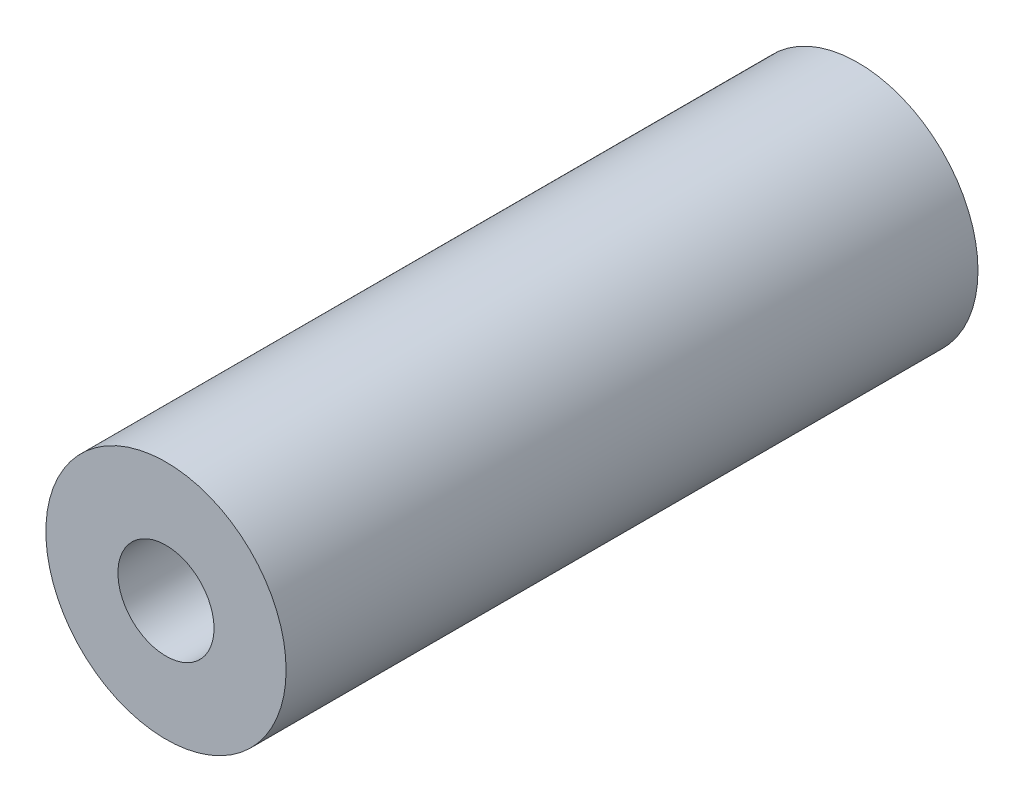
ISO-10303-21;
HEADER;
FILE_DESCRIPTION(('STEP AP214'),'2;1');
FILE_NAME('part.step','',(''),(''),'','','');
FILE_SCHEMA(('AUTOMOTIVE_DESIGN { 1 0 10303 214 1 1 1 1 }'));
ENDSEC;
DATA;
#1=APPLICATION_CONTEXT('core data for automotive mechanical design processes');
#2=APPLICATION_PROTOCOL_DEFINITION('international standard','automotive_design',2000,#1);
#3=PRODUCT_CONTEXT('',#1,'mechanical');
#4=PRODUCT('Part','Part','',(#3));
#5=PRODUCT_RELATED_PRODUCT_CATEGORY('part','',(#4));
#6=PRODUCT_DEFINITION_FORMATION('','',#4);
#7=PRODUCT_DEFINITION_CONTEXT('part definition',#1,'design');
#8=PRODUCT_DEFINITION('design','',#6,#7);
#9=PRODUCT_DEFINITION_SHAPE('','',#8);
#10=(LENGTH_UNIT() NAMED_UNIT(*) SI_UNIT(.MILLI.,.METRE.));
#11=(NAMED_UNIT(*) PLANE_ANGLE_UNIT() SI_UNIT($,.RADIAN.));
#12=(NAMED_UNIT(*) SI_UNIT($,.STERADIAN.) SOLID_ANGLE_UNIT());
#13=UNCERTAINTY_MEASURE_WITH_UNIT(LENGTH_MEASURE(1.E-05),#10,'distance_accuracy_value','');
#14=(GEOMETRIC_REPRESENTATION_CONTEXT(3) GLOBAL_UNCERTAINTY_ASSIGNED_CONTEXT((#13)) GLOBAL_UNIT_ASSIGNED_CONTEXT((#10,
#11,#12)) REPRESENTATION_CONTEXT('',''));
#15=CARTESIAN_POINT('',(0.,0.,0.));
#16=DIRECTION('',(0.,0.,1.));
#17=DIRECTION('',(1.,0.,0.));
#18=AXIS2_PLACEMENT_3D('',#15,#16,#17);
#19=CARTESIAN_POINT('',(0.,0.,18.288));
#20=DIRECTION('',(0.,0.,1.));
#21=DIRECTION('',(1.,0.,0.));
#22=AXIS2_PLACEMENT_3D('',#19,#20,#21);
#23=PLANE('',#22);
#24=CARTESIAN_POINT('',(0.,0.,18.288));
#25=DIRECTION('',(0.,0.,1.));
#26=DIRECTION('',(1.,0.,0.));
#27=AXIS2_PLACEMENT_3D('',#24,#25,#26);
#28=CIRCLE('',#27,3.175);
#29=CARTESIAN_POINT('',(3.175,0.,18.288));
#30=VERTEX_POINT('',#29);
#31=EDGE_CURVE('E11',#30,#30,#28,.T.);
#32=ORIENTED_EDGE('',*,*,#31,.T.);
#33=EDGE_LOOP('',(#32));
#34=FACE_BOUND('',#33,.T.);
#35=CARTESIAN_POINT('',(0.,0.,18.288));
#36=DIRECTION('',(0.,0.,1.));
#37=DIRECTION('',(1.,0.,0.));
#38=AXIS2_PLACEMENT_3D('',#35,#36,#37);
#39=CIRCLE('',#38,1.27);
#40=CARTESIAN_POINT('',(1.27,0.,18.288));
#41=VERTEX_POINT('',#40);
#42=EDGE_CURVE('E56',#41,#41,#39,.T.);
#43=ORIENTED_EDGE('',*,*,#42,.F.);
#44=EDGE_LOOP('',(#43));
#45=FACE_BOUND('',#44,.T.);
#46=ADVANCED_FACE('F43',(#34,#45),#23,.T.);
#47=CARTESIAN_POINT('',(0.,0.,0.));
#48=DIRECTION('',(0.,0.,1.));
#49=DIRECTION('',(1.,0.,0.));
#50=AXIS2_PLACEMENT_3D('',#47,#48,#49);
#51=PLANE('',#50);
#52=CARTESIAN_POINT('',(0.,0.,0.));
#53=DIRECTION('',(0.,0.,1.));
#54=DIRECTION('',(1.,0.,0.));
#55=AXIS2_PLACEMENT_3D('',#52,#53,#54);
#56=CIRCLE('',#55,3.175);
#57=CARTESIAN_POINT('',(3.175,0.,0.));
#58=VERTEX_POINT('',#57);
#59=EDGE_CURVE('E47',#58,#58,#56,.T.);
#60=ORIENTED_EDGE('',*,*,#59,.F.);
#61=EDGE_LOOP('',(#60));
#62=FACE_BOUND('',#61,.T.);
#63=CARTESIAN_POINT('',(0.,0.,0.));
#64=DIRECTION('',(0.,0.,1.));
#65=DIRECTION('',(1.,0.,0.));
#66=AXIS2_PLACEMENT_3D('',#63,#64,#65);
#67=CIRCLE('',#66,1.27);
#68=CARTESIAN_POINT('',(1.27,0.,0.));
#69=VERTEX_POINT('',#68);
#70=EDGE_CURVE('E58',#69,#69,#67,.T.);
#71=ORIENTED_EDGE('',*,*,#70,.T.);
#72=EDGE_LOOP('',(#71));
#73=FACE_BOUND('',#72,.T.);
#74=ADVANCED_FACE('F70',(#62,#73),#51,.F.);
#75=CARTESIAN_POINT('',(0.,0.,18.288));
#76=DIRECTION('',(0.,0.,-1.));
#77=DIRECTION('',(-1.,0.,0.));
#78=AXIS2_PLACEMENT_3D('',#75,#76,#77);
#79=CYLINDRICAL_SURFACE('',#78,3.175);
#80=ORIENTED_EDGE('',*,*,#31,.F.);
#81=EDGE_LOOP('',(#80));
#82=FACE_BOUND('',#81,.T.);
#83=ORIENTED_EDGE('',*,*,#59,.T.);
#84=EDGE_LOOP('',(#83));
#85=FACE_BOUND('',#84,.T.);
#86=ADVANCED_FACE('F45',(#82,#85),#79,.T.);
#87=CARTESIAN_POINT('',(0.,0.,18.288));
#88=DIRECTION('',(0.,0.,-1.));
#89=DIRECTION('',(-1.,0.,0.));
#90=AXIS2_PLACEMENT_3D('',#87,#88,#89);
#91=CYLINDRICAL_SURFACE('',#90,1.27);
#92=ORIENTED_EDGE('',*,*,#42,.T.);
#93=EDGE_LOOP('',(#92));
#94=FACE_BOUND('',#93,.T.);
#95=ORIENTED_EDGE('',*,*,#70,.F.);
#96=EDGE_LOOP('',(#95));
#97=FACE_BOUND('',#96,.T.);
#98=ADVANCED_FACE('F66',(#94,#97),#91,.F.);
#99=CLOSED_SHELL('',(#46,#74,#86,#98));
#100=MANIFOLD_SOLID_BREP('B2',#99);
#101=ADVANCED_BREP_SHAPE_REPRESENTATION('',(#18,#100),#14);
#102=SHAPE_DEFINITION_REPRESENTATION(#9,#101);
ENDSEC;
END-ISO-10303-21;
